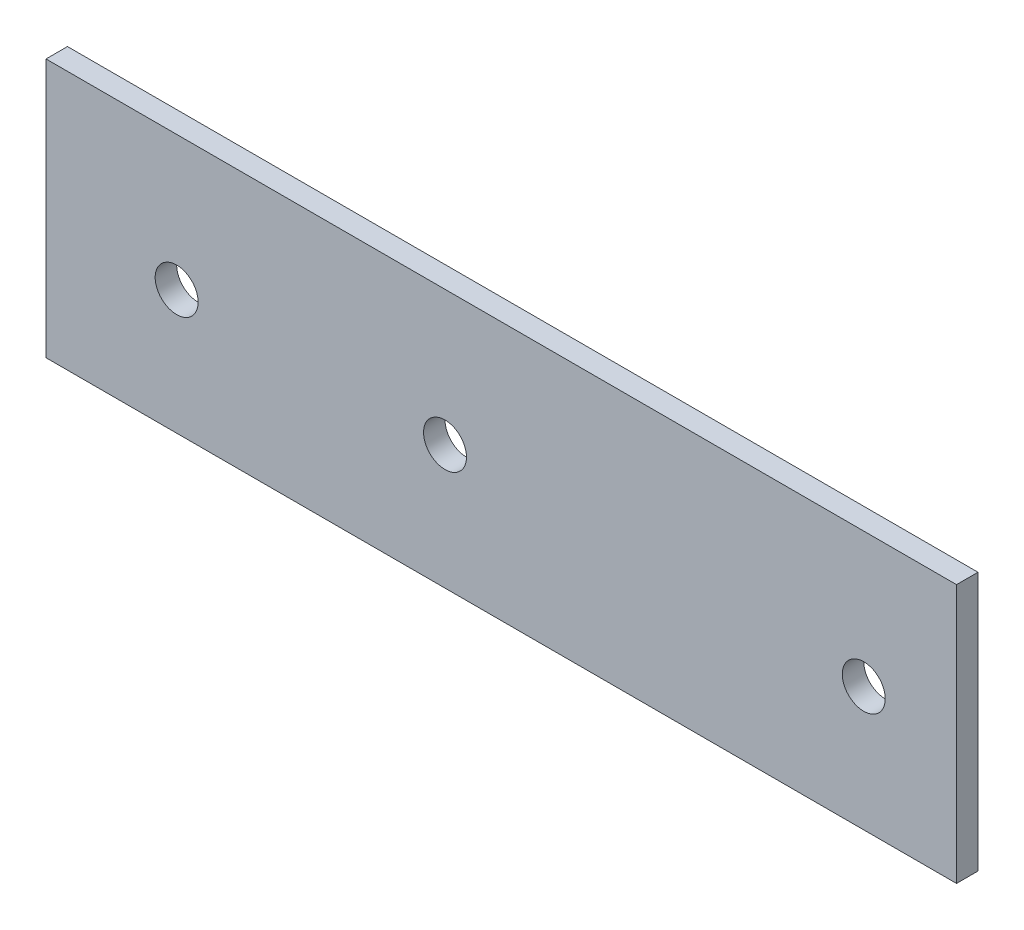
ISO-10303-21;
HEADER;
FILE_DESCRIPTION(('STEP AP214'),'2;1');
FILE_NAME('part.step','',(''),(''),'','','');
FILE_SCHEMA(('AUTOMOTIVE_DESIGN { 1 0 10303 214 1 1 1 1 }'));
ENDSEC;
DATA;
#1=APPLICATION_CONTEXT('core data for automotive mechanical design processes');
#2=APPLICATION_PROTOCOL_DEFINITION('international standard','automotive_design',2000,#1);
#3=PRODUCT_CONTEXT('',#1,'mechanical');
#4=PRODUCT('Part','Part','',(#3));
#5=PRODUCT_RELATED_PRODUCT_CATEGORY('part','',(#4));
#6=PRODUCT_DEFINITION_FORMATION('','',#4);
#7=PRODUCT_DEFINITION_CONTEXT('part definition',#1,'design');
#8=PRODUCT_DEFINITION('design','',#6,#7);
#9=PRODUCT_DEFINITION_SHAPE('','',#8);
#10=(LENGTH_UNIT() NAMED_UNIT(*) SI_UNIT(.MILLI.,.METRE.));
#11=(NAMED_UNIT(*) PLANE_ANGLE_UNIT() SI_UNIT($,.RADIAN.));
#12=(NAMED_UNIT(*) SI_UNIT($,.STERADIAN.) SOLID_ANGLE_UNIT());
#13=UNCERTAINTY_MEASURE_WITH_UNIT(LENGTH_MEASURE(1.E-05),#10,'distance_accuracy_value','');
#14=(GEOMETRIC_REPRESENTATION_CONTEXT(3) GLOBAL_UNCERTAINTY_ASSIGNED_CONTEXT((#13)) GLOBAL_UNIT_ASSIGNED_CONTEXT((#10,
#11,#12)) REPRESENTATION_CONTEXT('',''));
#15=CARTESIAN_POINT('',(0.,0.,0.));
#16=DIRECTION('',(0.,0.,1.));
#17=DIRECTION('',(1.,0.,0.));
#18=AXIS2_PLACEMENT_3D('',#15,#16,#17);
#19=CARTESIAN_POINT('',(0.,0.,3.175));
#20=DIRECTION('',(0.,0.,1.));
#21=DIRECTION('',(1.,0.,0.));
#22=AXIS2_PLACEMENT_3D('',#19,#20,#21);
#23=PLANE('',#22);
#24=CARTESIAN_POINT('',(76.2,5.55111512312578E-13,3.175));
#25=DIRECTION('',(0.,0.,1.));
#26=DIRECTION('',(1.,0.,0.));
#27=AXIS2_PLACEMENT_3D('',#24,#25,#26);
#28=CIRCLE('',#27,3.175);
#29=CARTESIAN_POINT('',(79.375,5.55111512312578E-13,3.175));
#30=VERTEX_POINT('',#29);
#31=EDGE_CURVE('E121',#30,#30,#28,.T.);
#32=ORIENTED_EDGE('',*,*,#31,.F.);
#33=EDGE_LOOP('',(#32));
#34=FACE_BOUND('',#33,.T.);
#35=DIRECTION('',(0.,-1.,0.));
#36=VECTOR('',#35,1.);
#37=CARTESIAN_POINT('',(-44.7179882894897,19.9046403163834,3.175));
#38=LINE('',#37,#36);
#39=CARTESIAN_POINT('',(-44.7179882894897,19.9046403163834,3.175));
#40=VERTEX_POINT('',#39);
#41=CARTESIAN_POINT('',(-44.7179882894897,-18.3616371868105,3.175));
#42=VERTEX_POINT('',#41);
#43=EDGE_CURVE('E91',#40,#42,#38,.T.);
#44=ORIENTED_EDGE('',*,*,#43,.T.);
#45=DIRECTION('',(1.,0.,0.));
#46=VECTOR('',#45,1.);
#47=CARTESIAN_POINT('',(-44.7179882894897,-18.3616371868105,3.175));
#48=LINE('',#47,#46);
#49=CARTESIAN_POINT('',(89.9152879421168,-18.3616371868105,3.175));
#50=VERTEX_POINT('',#49);
#51=EDGE_CURVE('E86',#42,#50,#48,.T.);
#52=ORIENTED_EDGE('',*,*,#51,.T.);
#53=DIRECTION('',(0.,1.,0.));
#54=VECTOR('',#53,1.);
#55=CARTESIAN_POINT('',(89.9152879421168,19.9046403163834,3.175));
#56=LINE('',#55,#54);
#57=CARTESIAN_POINT('',(89.9152879421168,19.9046403163834,3.175));
#58=VERTEX_POINT('',#57);
#59=EDGE_CURVE('E89',#50,#58,#56,.T.);
#60=ORIENTED_EDGE('',*,*,#59,.T.);
#61=DIRECTION('',(-1.,0.,0.));
#62=VECTOR('',#61,1.);
#63=CARTESIAN_POINT('',(-44.7179882894897,19.9046403163834,3.175));
#64=LINE('',#63,#62);
#65=EDGE_CURVE('E56',#58,#40,#64,.T.);
#66=ORIENTED_EDGE('',*,*,#65,.T.);
#67=EDGE_LOOP('',(#44,#52,#60,#66));
#68=FACE_BOUND('',#67,.T.);
#69=CARTESIAN_POINT('',(-25.4,-2.22044604925031E-13,3.175));
#70=DIRECTION('',(0.,0.,1.));
#71=DIRECTION('',(1.,0.,0.));
#72=AXIS2_PLACEMENT_3D('',#69,#70,#71);
#73=CIRCLE('',#72,3.175);
#74=CARTESIAN_POINT('',(-22.225,-2.22044604925031E-13,3.175));
#75=VERTEX_POINT('',#74);
#76=EDGE_CURVE('E106',#75,#75,#73,.T.);
#77=ORIENTED_EDGE('',*,*,#76,.F.);
#78=EDGE_LOOP('',(#77));
#79=FACE_BOUND('',#78,.T.);
#80=CARTESIAN_POINT('',(14.2807413753548,0.,3.175));
#81=DIRECTION('',(0.,0.,1.));
#82=DIRECTION('',(1.,0.,0.));
#83=AXIS2_PLACEMENT_3D('',#80,#81,#82);
#84=CIRCLE('',#83,3.175);
#85=CARTESIAN_POINT('',(17.4557413753548,0.,3.175));
#86=VERTEX_POINT('',#85);
#87=EDGE_CURVE('E127',#86,#86,#84,.T.);
#88=ORIENTED_EDGE('',*,*,#87,.F.);
#89=EDGE_LOOP('',(#88));
#90=FACE_BOUND('',#89,.T.);
#91=ADVANCED_FACE('F39',(#34,#68,#79,#90),#23,.T.);
#92=CARTESIAN_POINT('',(0.,0.,0.));
#93=DIRECTION('',(0.,0.,1.));
#94=DIRECTION('',(1.,0.,0.));
#95=AXIS2_PLACEMENT_3D('',#92,#93,#94);
#96=PLANE('',#95);
#97=DIRECTION('',(0.,-1.,0.));
#98=VECTOR('',#97,1.);
#99=CARTESIAN_POINT('',(-44.7179882894897,19.9046403163834,0.));
#100=LINE('',#99,#98);
#101=CARTESIAN_POINT('',(-44.7179882894897,19.9046403163834,0.));
#102=VERTEX_POINT('',#101);
#103=CARTESIAN_POINT('',(-44.7179882894897,-18.3616371868105,0.));
#104=VERTEX_POINT('',#103);
#105=EDGE_CURVE('E103',#102,#104,#100,.T.);
#106=ORIENTED_EDGE('',*,*,#105,.F.);
#107=DIRECTION('',(-1.,0.,0.));
#108=VECTOR('',#107,1.);
#109=CARTESIAN_POINT('',(-44.7179882894897,19.9046403163834,0.));
#110=LINE('',#109,#108);
#111=CARTESIAN_POINT('',(89.9152879421168,19.9046403163834,0.));
#112=VERTEX_POINT('',#111);
#113=EDGE_CURVE('E79',#112,#102,#110,.T.);
#114=ORIENTED_EDGE('',*,*,#113,.F.);
#115=DIRECTION('',(0.,1.,0.));
#116=VECTOR('',#115,1.);
#117=CARTESIAN_POINT('',(89.9152879421168,19.9046403163834,0.));
#118=LINE('',#117,#116);
#119=CARTESIAN_POINT('',(89.9152879421168,-18.3616371868105,0.));
#120=VERTEX_POINT('',#119);
#121=EDGE_CURVE('E73',#120,#112,#118,.T.);
#122=ORIENTED_EDGE('',*,*,#121,.F.);
#123=DIRECTION('',(1.,0.,0.));
#124=VECTOR('',#123,1.);
#125=CARTESIAN_POINT('',(-44.7179882894897,-18.3616371868105,0.));
#126=LINE('',#125,#124);
#127=EDGE_CURVE('E95',#104,#120,#126,.T.);
#128=ORIENTED_EDGE('',*,*,#127,.F.);
#129=EDGE_LOOP('',(#106,#114,#122,#128));
#130=FACE_BOUND('',#129,.T.);
#131=CARTESIAN_POINT('',(-25.4,-2.22044604925031E-13,0.));
#132=DIRECTION('',(0.,0.,1.));
#133=DIRECTION('',(1.,0.,0.));
#134=AXIS2_PLACEMENT_3D('',#131,#132,#133);
#135=CIRCLE('',#134,3.175);
#136=CARTESIAN_POINT('',(-22.225,-2.22044604925031E-13,0.));
#137=VERTEX_POINT('',#136);
#138=EDGE_CURVE('E118',#137,#137,#135,.T.);
#139=ORIENTED_EDGE('',*,*,#138,.T.);
#140=EDGE_LOOP('',(#139));
#141=FACE_BOUND('',#140,.T.);
#142=CARTESIAN_POINT('',(76.2,5.55111512312578E-13,0.));
#143=DIRECTION('',(0.,0.,1.));
#144=DIRECTION('',(1.,0.,0.));
#145=AXIS2_PLACEMENT_3D('',#142,#143,#144);
#146=CIRCLE('',#145,3.175);
#147=CARTESIAN_POINT('',(79.375,5.55111512312578E-13,0.));
#148=VERTEX_POINT('',#147);
#149=EDGE_CURVE('E124',#148,#148,#146,.T.);
#150=ORIENTED_EDGE('',*,*,#149,.T.);
#151=EDGE_LOOP('',(#150));
#152=FACE_BOUND('',#151,.T.);
#153=CARTESIAN_POINT('',(14.2807413753548,0.,0.));
#154=DIRECTION('',(0.,0.,1.));
#155=DIRECTION('',(1.,0.,0.));
#156=AXIS2_PLACEMENT_3D('',#153,#154,#155);
#157=CIRCLE('',#156,3.175);
#158=CARTESIAN_POINT('',(17.4557413753548,0.,0.));
#159=VERTEX_POINT('',#158);
#160=EDGE_CURVE('E130',#159,#159,#157,.T.);
#161=ORIENTED_EDGE('',*,*,#160,.T.);
#162=EDGE_LOOP('',(#161));
#163=FACE_BOUND('',#162,.T.);
#164=ADVANCED_FACE('F114',(#130,#141,#152,#163),#96,.F.);
#165=CARTESIAN_POINT('',(-44.7179882894897,19.9046403163834,3.175));
#166=DIRECTION('',(1.,0.,0.));
#167=DIRECTION('',(0.,0.,-1.));
#168=AXIS2_PLACEMENT_3D('',#165,#166,#167);
#169=PLANE('',#168);
#170=ORIENTED_EDGE('',*,*,#105,.T.);
#171=DIRECTION('',(0.,0.,-1.));
#172=VECTOR('',#171,1.);
#173=CARTESIAN_POINT('',(-44.7179882894897,-18.3616371868105,3.175));
#174=LINE('',#173,#172);
#175=EDGE_CURVE('E11',#42,#104,#174,.T.);
#176=ORIENTED_EDGE('',*,*,#175,.F.);
#177=ORIENTED_EDGE('',*,*,#43,.F.);
#178=DIRECTION('',(0.,0.,-1.));
#179=VECTOR('',#178,1.);
#180=CARTESIAN_POINT('',(-44.7179882894897,19.9046403163834,3.175));
#181=LINE('',#180,#179);
#182=EDGE_CURVE('E99',#40,#102,#181,.T.);
#183=ORIENTED_EDGE('',*,*,#182,.T.);
#184=EDGE_LOOP('',(#170,#176,#177,#183));
#185=FACE_BOUND('',#184,.T.);
#186=ADVANCED_FACE('F41',(#185),#169,.F.);
#187=CARTESIAN_POINT('',(-44.7179882894897,-18.3616371868105,3.175));
#188=DIRECTION('',(0.,1.,0.));
#189=DIRECTION('',(0.,0.,1.));
#190=AXIS2_PLACEMENT_3D('',#187,#188,#189);
#191=PLANE('',#190);
#192=ORIENTED_EDGE('',*,*,#127,.T.);
#193=DIRECTION('',(0.,0.,-1.));
#194=VECTOR('',#193,1.);
#195=CARTESIAN_POINT('',(89.9152879421168,-18.3616371868105,3.175));
#196=LINE('',#195,#194);
#197=EDGE_CURVE('E48',#50,#120,#196,.T.);
#198=ORIENTED_EDGE('',*,*,#197,.F.);
#199=ORIENTED_EDGE('',*,*,#51,.F.);
#200=ORIENTED_EDGE('',*,*,#175,.T.);
#201=EDGE_LOOP('',(#192,#198,#199,#200));
#202=FACE_BOUND('',#201,.T.);
#203=ADVANCED_FACE('F94',(#202),#191,.F.);
#204=CARTESIAN_POINT('',(89.9152879421168,19.9046403163834,3.175));
#205=DIRECTION('',(-1.,0.,0.));
#206=DIRECTION('',(0.,0.,1.));
#207=AXIS2_PLACEMENT_3D('',#204,#205,#206);
#208=PLANE('',#207);
#209=ORIENTED_EDGE('',*,*,#121,.T.);
#210=DIRECTION('',(0.,0.,-1.));
#211=VECTOR('',#210,1.);
#212=CARTESIAN_POINT('',(89.9152879421168,19.9046403163834,3.175));
#213=LINE('',#212,#211);
#214=EDGE_CURVE('E96',#58,#112,#213,.T.);
#215=ORIENTED_EDGE('',*,*,#214,.F.);
#216=ORIENTED_EDGE('',*,*,#59,.F.);
#217=ORIENTED_EDGE('',*,*,#197,.T.);
#218=EDGE_LOOP('',(#209,#215,#216,#217));
#219=FACE_BOUND('',#218,.T.);
#220=ADVANCED_FACE('F97',(#219),#208,.F.);
#221=CARTESIAN_POINT('',(-44.7179882894897,19.9046403163834,3.175));
#222=DIRECTION('',(0.,-1.,0.));
#223=DIRECTION('',(0.,0.,-1.));
#224=AXIS2_PLACEMENT_3D('',#221,#222,#223);
#225=PLANE('',#224);
#226=ORIENTED_EDGE('',*,*,#113,.T.);
#227=ORIENTED_EDGE('',*,*,#182,.F.);
#228=ORIENTED_EDGE('',*,*,#65,.F.);
#229=ORIENTED_EDGE('',*,*,#214,.T.);
#230=EDGE_LOOP('',(#226,#227,#228,#229));
#231=FACE_BOUND('',#230,.T.);
#232=ADVANCED_FACE('F111',(#231),#225,.F.);
#233=CARTESIAN_POINT('',(-25.4,-2.22044604925031E-13,3.175));
#234=DIRECTION('',(0.,0.,-1.));
#235=DIRECTION('',(-1.,0.,0.));
#236=AXIS2_PLACEMENT_3D('',#233,#234,#235);
#237=CYLINDRICAL_SURFACE('',#236,3.175);
#238=ORIENTED_EDGE('',*,*,#76,.T.);
#239=EDGE_LOOP('',(#238));
#240=FACE_BOUND('',#239,.T.);
#241=ORIENTED_EDGE('',*,*,#138,.F.);
#242=EDGE_LOOP('',(#241));
#243=FACE_BOUND('',#242,.T.);
#244=ADVANCED_FACE('F148',(#240,#243),#237,.F.);
#245=CARTESIAN_POINT('',(76.2,5.55111512312578E-13,3.175));
#246=DIRECTION('',(0.,0.,-1.));
#247=DIRECTION('',(-1.,0.,0.));
#248=AXIS2_PLACEMENT_3D('',#245,#246,#247);
#249=CYLINDRICAL_SURFACE('',#248,3.175);
#250=ORIENTED_EDGE('',*,*,#31,.T.);
#251=EDGE_LOOP('',(#250));
#252=FACE_BOUND('',#251,.T.);
#253=ORIENTED_EDGE('',*,*,#149,.F.);
#254=EDGE_LOOP('',(#253));
#255=FACE_BOUND('',#254,.T.);
#256=ADVANCED_FACE('F193',(#252,#255),#249,.F.);
#257=CARTESIAN_POINT('',(14.2807413753548,0.,3.175));
#258=DIRECTION('',(0.,0.,-1.));
#259=DIRECTION('',(-1.,0.,0.));
#260=AXIS2_PLACEMENT_3D('',#257,#258,#259);
#261=CYLINDRICAL_SURFACE('',#260,3.175);
#262=ORIENTED_EDGE('',*,*,#87,.T.);
#263=EDGE_LOOP('',(#262));
#264=FACE_BOUND('',#263,.T.);
#265=ORIENTED_EDGE('',*,*,#160,.F.);
#266=EDGE_LOOP('',(#265));
#267=FACE_BOUND('',#266,.T.);
#268=ADVANCED_FACE('F136',(#264,#267),#261,.F.);
#269=CLOSED_SHELL('',(#91,#164,#186,#203,#220,#232,#244,#256,#268));
#270=MANIFOLD_SOLID_BREP('B2',#269);
#271=ADVANCED_BREP_SHAPE_REPRESENTATION('',(#18,#270),#14);
#272=SHAPE_DEFINITION_REPRESENTATION(#9,#271);
ENDSEC;
END-ISO-10303-21;
